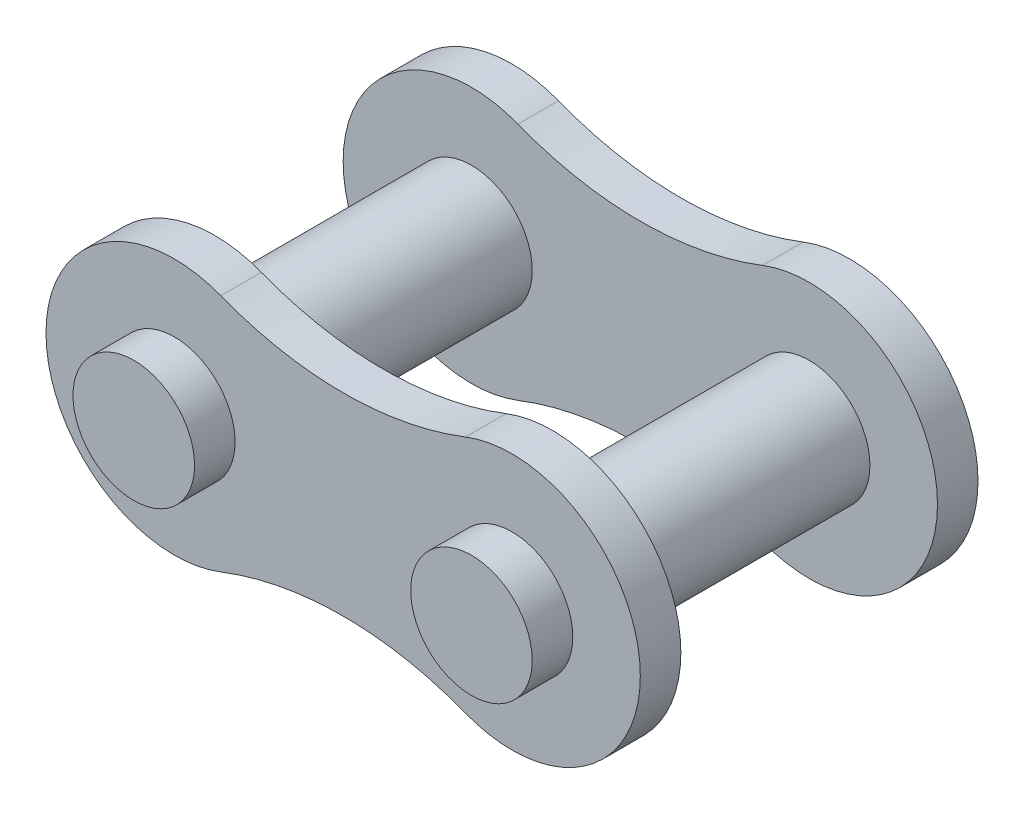
ISO-10303-21;
HEADER;
FILE_DESCRIPTION(('STEP AP214'),'2;1');
FILE_NAME('part.step','',(''),(''),'','','');
FILE_SCHEMA(('AUTOMOTIVE_DESIGN { 1 0 10303 214 1 1 1 1 }'));
ENDSEC;
DATA;
#1=APPLICATION_CONTEXT('core data for automotive mechanical design processes');
#2=APPLICATION_PROTOCOL_DEFINITION('international standard','automotive_design',2000,#1);
#3=PRODUCT_CONTEXT('',#1,'mechanical');
#4=PRODUCT('Part','Part','',(#3));
#5=PRODUCT_RELATED_PRODUCT_CATEGORY('part','',(#4));
#6=PRODUCT_DEFINITION_FORMATION('','',#4);
#7=PRODUCT_DEFINITION_CONTEXT('part definition',#1,'design');
#8=PRODUCT_DEFINITION('design','',#6,#7);
#9=PRODUCT_DEFINITION_SHAPE('','',#8);
#10=(LENGTH_UNIT() NAMED_UNIT(*) SI_UNIT(.MILLI.,.METRE.));
#11=(NAMED_UNIT(*) PLANE_ANGLE_UNIT() SI_UNIT($,.RADIAN.));
#12=(NAMED_UNIT(*) SI_UNIT($,.STERADIAN.) SOLID_ANGLE_UNIT());
#13=UNCERTAINTY_MEASURE_WITH_UNIT(LENGTH_MEASURE(1.E-05),#10,'distance_accuracy_value','');
#14=(GEOMETRIC_REPRESENTATION_CONTEXT(3) GLOBAL_UNCERTAINTY_ASSIGNED_CONTEXT((#13)) GLOBAL_UNIT_ASSIGNED_CONTEXT((#10,
#11,#12)) REPRESENTATION_CONTEXT('',''));
#15=CARTESIAN_POINT('',(0.,0.,0.));
#16=DIRECTION('',(0.,0.,1.));
#17=DIRECTION('',(1.,0.,0.));
#18=AXIS2_PLACEMENT_3D('',#15,#16,#17);
#19=CARTESIAN_POINT('',(-12.7,0.,3.937));
#20=DIRECTION('',(0.,0.,-1.));
#21=DIRECTION('',(-1.,0.,0.));
#22=AXIS2_PLACEMENT_3D('',#19,#20,#21);
#23=CYLINDRICAL_SURFACE('',#22,1.143);
#24=CARTESIAN_POINT('',(-12.7,0.,-2.413));
#25=DIRECTION('',(0.,0.,1.));
#26=DIRECTION('',(1.,0.,0.));
#27=AXIS2_PLACEMENT_3D('',#24,#25,#26);
#28=CIRCLE('',#27,1.143);
#29=CARTESIAN_POINT('',(-11.557,0.,-2.413));
#30=VERTEX_POINT('',#29);
#31=EDGE_CURVE('E170',#30,#30,#28,.T.);
#32=ORIENTED_EDGE('',*,*,#31,.T.);
#33=EDGE_LOOP('',(#32));
#34=FACE_BOUND('',#33,.T.);
#35=CARTESIAN_POINT('',(-12.7,0.,2.413));
#36=DIRECTION('',(0.,0.,1.));
#37=DIRECTION('',(1.,0.,0.));
#38=AXIS2_PLACEMENT_3D('',#35,#36,#37);
#39=CIRCLE('',#38,1.143);
#40=CARTESIAN_POINT('',(-11.557,0.,2.413));
#41=VERTEX_POINT('',#40);
#42=EDGE_CURVE('E11',#41,#41,#39,.T.);
#43=ORIENTED_EDGE('',*,*,#42,.F.);
#44=EDGE_LOOP('',(#43));
#45=FACE_BOUND('',#44,.T.);
#46=ADVANCED_FACE('F37',(#34,#45),#23,.T.);
#47=CARTESIAN_POINT('',(-9.525,-8.16759107693327,-2.413));
#48=DIRECTION('',(0.,0.,-1.));
#49=DIRECTION('',(1.,0.,0.));
#50=AXIS2_PLACEMENT_3D('',#47,#48,#49);
#51=CYLINDRICAL_SURFACE('',#50,6.35);
#52=CARTESIAN_POINT('',(-9.525,-8.16759107693327,-3.175));
#53=DIRECTION('',(0.,0.,-1.));
#54=DIRECTION('',(1.,0.,0.));
#55=AXIS2_PLACEMENT_3D('',#52,#53,#54);
#56=CIRCLE('',#55,6.35);
#57=CARTESIAN_POINT('',(-11.8257246376812,-2.24904681828597,-3.175));
#58=VERTEX_POINT('',#57);
#59=CARTESIAN_POINT('',(-7.22427536231884,-2.24904681828597,-3.175));
#60=VERTEX_POINT('',#59);
#61=EDGE_CURVE('E173',#58,#60,#56,.T.);
#62=ORIENTED_EDGE('',*,*,#61,.T.);
#63=DIRECTION('',(0.,0.,-1.));
#64=VECTOR('',#63,1.);
#65=CARTESIAN_POINT('',(-7.22427536231884,-2.24904681828597,-2.413));
#66=LINE('',#65,#64);
#67=CARTESIAN_POINT('',(-7.22427536231884,-2.24904681828597,-2.413));
#68=VERTEX_POINT('',#67);
#69=EDGE_CURVE('E180',#68,#60,#66,.T.);
#70=ORIENTED_EDGE('',*,*,#69,.F.);
#71=CARTESIAN_POINT('',(-9.525,-8.16759107693327,-2.413));
#72=DIRECTION('',(0.,0.,-1.));
#73=DIRECTION('',(1.,0.,0.));
#74=AXIS2_PLACEMENT_3D('',#71,#72,#73);
#75=CIRCLE('',#74,6.35);
#76=CARTESIAN_POINT('',(-11.8257246376812,-2.24904681828597,-2.413));
#77=VERTEX_POINT('',#76);
#78=EDGE_CURVE('E174',#77,#68,#75,.T.);
#79=ORIENTED_EDGE('',*,*,#78,.F.);
#80=DIRECTION('',(0.,0.,-1.));
#81=VECTOR('',#80,1.);
#82=CARTESIAN_POINT('',(-11.8257246376812,-2.24904681828597,-2.413));
#83=LINE('',#82,#81);
#84=EDGE_CURVE('E46',#77,#58,#83,.T.);
#85=ORIENTED_EDGE('',*,*,#84,.T.);
#86=EDGE_LOOP('',(#62,#70,#79,#85));
#87=FACE_BOUND('',#86,.T.);
#88=ADVANCED_FACE('F39',(#87),#51,.F.);
#89=CARTESIAN_POINT('',(-12.7,0.,-2.413));
#90=DIRECTION('',(0.,0.,-1.));
#91=DIRECTION('',(1.,0.,0.));
#92=AXIS2_PLACEMENT_3D('',#89,#90,#91);
#93=CYLINDRICAL_SURFACE('',#92,2.413);
#94=CARTESIAN_POINT('',(-12.7,0.,-3.175));
#95=DIRECTION('',(0.,0.,1.));
#96=DIRECTION('',(1.,0.,0.));
#97=AXIS2_PLACEMENT_3D('',#94,#95,#96);
#98=CIRCLE('',#97,2.413);
#99=CARTESIAN_POINT('',(-11.8257246376812,2.24904681828597,-3.175));
#100=VERTEX_POINT('',#99);
#101=EDGE_CURVE('E78',#100,#58,#98,.T.);
#102=ORIENTED_EDGE('',*,*,#101,.T.);
#103=ORIENTED_EDGE('',*,*,#84,.F.);
#104=CARTESIAN_POINT('',(-12.7,0.,-2.413));
#105=DIRECTION('',(0.,0.,1.));
#106=DIRECTION('',(1.,0.,0.));
#107=AXIS2_PLACEMENT_3D('',#104,#105,#106);
#108=CIRCLE('',#107,2.413);
#109=CARTESIAN_POINT('',(-11.8257246376812,2.24904681828597,-2.413));
#110=VERTEX_POINT('',#109);
#111=EDGE_CURVE('E54',#110,#77,#108,.T.);
#112=ORIENTED_EDGE('',*,*,#111,.F.);
#113=DIRECTION('',(0.,0.,-1.));
#114=VECTOR('',#113,1.);
#115=CARTESIAN_POINT('',(-11.8257246376812,2.24904681828597,-2.413));
#116=LINE('',#115,#114);
#117=EDGE_CURVE('E188',#110,#100,#116,.T.);
#118=ORIENTED_EDGE('',*,*,#117,.T.);
#119=EDGE_LOOP('',(#102,#103,#112,#118));
#120=FACE_BOUND('',#119,.T.);
#121=ADVANCED_FACE('F222',(#120),#93,.T.);
#122=CARTESIAN_POINT('',(-9.525,8.16759107693327,-2.413));
#123=DIRECTION('',(0.,0.,-1.));
#124=DIRECTION('',(1.,0.,0.));
#125=AXIS2_PLACEMENT_3D('',#122,#123,#124);
#126=CYLINDRICAL_SURFACE('',#125,6.35);
#127=CARTESIAN_POINT('',(-9.525,8.16759107693327,-3.175));
#128=DIRECTION('',(0.,0.,-1.));
#129=DIRECTION('',(1.,0.,0.));
#130=AXIS2_PLACEMENT_3D('',#127,#128,#129);
#131=CIRCLE('',#130,6.35);
#132=CARTESIAN_POINT('',(-7.22427536231884,2.24904681828597,-3.175));
#133=VERTEX_POINT('',#132);
#134=EDGE_CURVE('E72',#133,#100,#131,.T.);
#135=ORIENTED_EDGE('',*,*,#134,.T.);
#136=ORIENTED_EDGE('',*,*,#117,.F.);
#137=CARTESIAN_POINT('',(-9.525,8.16759107693327,-2.413));
#138=DIRECTION('',(0.,0.,-1.));
#139=DIRECTION('',(1.,0.,0.));
#140=AXIS2_PLACEMENT_3D('',#137,#138,#139);
#141=CIRCLE('',#140,6.35);
#142=CARTESIAN_POINT('',(-7.22427536231884,2.24904681828597,-2.413));
#143=VERTEX_POINT('',#142);
#144=EDGE_CURVE('E177',#143,#110,#141,.T.);
#145=ORIENTED_EDGE('',*,*,#144,.F.);
#146=DIRECTION('',(0.,0.,-1.));
#147=VECTOR('',#146,1.);
#148=CARTESIAN_POINT('',(-7.22427536231884,2.24904681828597,-2.413));
#149=LINE('',#148,#147);
#150=EDGE_CURVE('E190',#143,#133,#149,.T.);
#151=ORIENTED_EDGE('',*,*,#150,.T.);
#152=EDGE_LOOP('',(#135,#136,#145,#151));
#153=FACE_BOUND('',#152,.T.);
#154=ADVANCED_FACE('F373',(#153),#126,.F.);
#155=CARTESIAN_POINT('',(-6.35,0.,-2.413));
#156=DIRECTION('',(0.,0.,-1.));
#157=DIRECTION('',(1.,0.,0.));
#158=AXIS2_PLACEMENT_3D('',#155,#156,#157);
#159=CYLINDRICAL_SURFACE('',#158,2.413);
#160=CARTESIAN_POINT('',(-6.35,0.,-3.175));
#161=DIRECTION('',(0.,0.,1.));
#162=DIRECTION('',(1.,0.,0.));
#163=AXIS2_PLACEMENT_3D('',#160,#161,#162);
#164=CIRCLE('',#163,2.413);
#165=EDGE_CURVE('E183',#60,#133,#164,.T.);
#166=ORIENTED_EDGE('',*,*,#165,.T.);
#167=ORIENTED_EDGE('',*,*,#150,.F.);
#168=CARTESIAN_POINT('',(-6.35,0.,-2.413));
#169=DIRECTION('',(0.,0.,1.));
#170=DIRECTION('',(1.,0.,0.));
#171=AXIS2_PLACEMENT_3D('',#168,#169,#170);
#172=CIRCLE('',#171,2.413);
#173=EDGE_CURVE('E86',#68,#143,#172,.T.);
#174=ORIENTED_EDGE('',*,*,#173,.F.);
#175=ORIENTED_EDGE('',*,*,#69,.T.);
#176=EDGE_LOOP('',(#166,#167,#174,#175));
#177=FACE_BOUND('',#176,.T.);
#178=ADVANCED_FACE('F192',(#177),#159,.T.);
#179=CARTESIAN_POINT('',(-11.1125,-4.08379553846664,-2.413));
#180=DIRECTION('',(0.,0.,-1.));
#181=DIRECTION('',(1.,0.,0.));
#182=AXIS2_PLACEMENT_3D('',#179,#180,#181);
#183=PLANE('',#182);
#184=CARTESIAN_POINT('',(-6.35,0.,-2.413));
#185=DIRECTION('',(0.,0.,1.));
#186=DIRECTION('',(1.,0.,0.));
#187=AXIS2_PLACEMENT_3D('',#184,#185,#186);
#188=CIRCLE('',#187,1.143);
#189=CARTESIAN_POINT('',(-5.207,0.,-2.413));
#190=VERTEX_POINT('',#189);
#191=EDGE_CURVE('E167',#190,#190,#188,.T.);
#192=ORIENTED_EDGE('',*,*,#191,.F.);
#193=EDGE_LOOP('',(#192));
#194=FACE_BOUND('',#193,.T.);
#195=ORIENTED_EDGE('',*,*,#31,.F.);
#196=EDGE_LOOP('',(#195));
#197=FACE_BOUND('',#196,.T.);
#198=ORIENTED_EDGE('',*,*,#78,.T.);
#199=ORIENTED_EDGE('',*,*,#173,.T.);
#200=ORIENTED_EDGE('',*,*,#144,.T.);
#201=ORIENTED_EDGE('',*,*,#111,.T.);
#202=EDGE_LOOP('',(#198,#199,#200,#201));
#203=FACE_BOUND('',#202,.T.);
#204=ADVANCED_FACE('F200',(#194,#197,#203),#183,.F.);
#205=CARTESIAN_POINT('',(-11.1125,-4.08379553846664,-3.175));
#206=DIRECTION('',(0.,0.,-1.));
#207=DIRECTION('',(1.,0.,0.));
#208=AXIS2_PLACEMENT_3D('',#205,#206,#207);
#209=PLANE('',#208);
#210=CARTESIAN_POINT('',(-6.35,0.,-3.175));
#211=DIRECTION('',(0.,0.,-1.));
#212=DIRECTION('',(-1.,0.,0.));
#213=AXIS2_PLACEMENT_3D('',#210,#211,#212);
#214=CIRCLE('',#213,1.143);
#215=CARTESIAN_POINT('',(-7.493,0.,-3.175));
#216=VERTEX_POINT('',#215);
#217=EDGE_CURVE('E357',#216,#216,#214,.F.);
#218=ORIENTED_EDGE('',*,*,#217,.T.);
#219=EDGE_LOOP('',(#218));
#220=FACE_BOUND('',#219,.T.);
#221=CARTESIAN_POINT('',(-12.7,0.,-3.175));
#222=DIRECTION('',(0.,0.,-1.));
#223=DIRECTION('',(-1.,0.,0.));
#224=AXIS2_PLACEMENT_3D('',#221,#222,#223);
#225=CIRCLE('',#224,1.143);
#226=CARTESIAN_POINT('',(-13.843,0.,-3.175));
#227=VERTEX_POINT('',#226);
#228=EDGE_CURVE('E162',#227,#227,#225,.F.);
#229=ORIENTED_EDGE('',*,*,#228,.T.);
#230=EDGE_LOOP('',(#229));
#231=FACE_BOUND('',#230,.T.);
#232=ORIENTED_EDGE('',*,*,#61,.F.);
#233=ORIENTED_EDGE('',*,*,#101,.F.);
#234=ORIENTED_EDGE('',*,*,#134,.F.);
#235=ORIENTED_EDGE('',*,*,#165,.F.);
#236=EDGE_LOOP('',(#232,#233,#234,#235));
#237=FACE_BOUND('',#236,.T.);
#238=ADVANCED_FACE('F197',(#220,#231,#237),#209,.T.);
#239=CARTESIAN_POINT('',(-12.7,0.,-3.937));
#240=DIRECTION('',(0.,0.,1.));
#241=DIRECTION('',(1.,0.,0.));
#242=AXIS2_PLACEMENT_3D('',#239,#240,#241);
#243=PLANE('',#242);
#244=CARTESIAN_POINT('',(-12.7,0.,-3.937));
#245=DIRECTION('',(0.,0.,1.));
#246=DIRECTION('',(1.,0.,0.));
#247=AXIS2_PLACEMENT_3D('',#244,#245,#246);
#248=CIRCLE('',#247,1.143);
#249=CARTESIAN_POINT('',(-11.557,0.,-3.937));
#250=VERTEX_POINT('',#249);
#251=EDGE_CURVE('E155',#250,#250,#248,.T.);
#252=ORIENTED_EDGE('',*,*,#251,.F.);
#253=EDGE_LOOP('',(#252));
#254=FACE_BOUND('',#253,.T.);
#255=ADVANCED_FACE('F199',(#254),#243,.F.);
#256=ORIENTED_EDGE('',*,*,#228,.F.);
#257=EDGE_LOOP('',(#256));
#258=FACE_BOUND('',#257,.T.);
#259=ORIENTED_EDGE('',*,*,#251,.T.);
#260=EDGE_LOOP('',(#259));
#261=FACE_BOUND('',#260,.T.);
#262=ADVANCED_FACE('F207',(#258,#261),#23,.T.);
#263=CARTESIAN_POINT('',(-9.525,-8.16759107693327,2.413));
#264=DIRECTION('',(0.,0.,1.));
#265=DIRECTION('',(1.,0.,0.));
#266=AXIS2_PLACEMENT_3D('',#263,#264,#265);
#267=CYLINDRICAL_SURFACE('',#266,6.35);
#268=CARTESIAN_POINT('',(-9.525,-8.16759107693327,3.175));
#269=DIRECTION('',(0.,0.,-1.));
#270=DIRECTION('',(1.,0.,0.));
#271=AXIS2_PLACEMENT_3D('',#268,#269,#270);
#272=CIRCLE('',#271,6.35);
#273=CARTESIAN_POINT('',(-11.8257246376812,-2.24904681828597,3.175));
#274=VERTEX_POINT('',#273);
#275=CARTESIAN_POINT('',(-7.22427536231884,-2.24904681828597,3.175));
#276=VERTEX_POINT('',#275);
#277=EDGE_CURVE('E149',#274,#276,#272,.T.);
#278=ORIENTED_EDGE('',*,*,#277,.F.);
#279=DIRECTION('',(0.,0.,1.));
#280=VECTOR('',#279,1.);
#281=CARTESIAN_POINT('',(-11.8257246376812,-2.24904681828597,2.413));
#282=LINE('',#281,#280);
#283=CARTESIAN_POINT('',(-11.8257246376812,-2.24904681828597,2.413));
#284=VERTEX_POINT('',#283);
#285=EDGE_CURVE('E137',#284,#274,#282,.T.);
#286=ORIENTED_EDGE('',*,*,#285,.F.);
#287=CARTESIAN_POINT('',(-9.525,-8.16759107693327,2.413));
#288=DIRECTION('',(0.,0.,-1.));
#289=DIRECTION('',(1.,0.,0.));
#290=AXIS2_PLACEMENT_3D('',#287,#288,#289);
#291=CIRCLE('',#290,6.35);
#292=CARTESIAN_POINT('',(-7.22427536231884,-2.24904681828597,2.413));
#293=VERTEX_POINT('',#292);
#294=EDGE_CURVE('E131',#284,#293,#291,.T.);
#295=ORIENTED_EDGE('',*,*,#294,.T.);
#296=DIRECTION('',(0.,0.,1.));
#297=VECTOR('',#296,1.);
#298=CARTESIAN_POINT('',(-7.22427536231884,-2.24904681828597,2.413));
#299=LINE('',#298,#297);
#300=EDGE_CURVE('E113',#293,#276,#299,.T.);
#301=ORIENTED_EDGE('',*,*,#300,.T.);
#302=EDGE_LOOP('',(#278,#286,#295,#301));
#303=FACE_BOUND('',#302,.T.);
#304=ADVANCED_FACE('F136',(#303),#267,.F.);
#305=CARTESIAN_POINT('',(-12.7,0.,2.413));
#306=DIRECTION('',(0.,0.,1.));
#307=DIRECTION('',(1.,0.,0.));
#308=AXIS2_PLACEMENT_3D('',#305,#306,#307);
#309=CYLINDRICAL_SURFACE('',#308,2.413);
#310=CARTESIAN_POINT('',(-12.7,0.,3.175));
#311=DIRECTION('',(0.,0.,1.));
#312=DIRECTION('',(1.,0.,0.));
#313=AXIS2_PLACEMENT_3D('',#310,#311,#312);
#314=CIRCLE('',#313,2.413);
#315=CARTESIAN_POINT('',(-11.8257246376812,2.24904681828597,3.175));
#316=VERTEX_POINT('',#315);
#317=EDGE_CURVE('E138',#316,#274,#314,.T.);
#318=ORIENTED_EDGE('',*,*,#317,.F.);
#319=DIRECTION('',(0.,0.,1.));
#320=VECTOR('',#319,1.);
#321=CARTESIAN_POINT('',(-11.8257246376812,2.24904681828597,2.413));
#322=LINE('',#321,#320);
#323=CARTESIAN_POINT('',(-11.8257246376812,2.24904681828597,2.413));
#324=VERTEX_POINT('',#323);
#325=EDGE_CURVE('E156',#324,#316,#322,.T.);
#326=ORIENTED_EDGE('',*,*,#325,.F.);
#327=CARTESIAN_POINT('',(-12.7,0.,2.413));
#328=DIRECTION('',(0.,0.,1.));
#329=DIRECTION('',(1.,0.,0.));
#330=AXIS2_PLACEMENT_3D('',#327,#328,#329);
#331=CIRCLE('',#330,2.413);
#332=EDGE_CURVE('E124',#324,#284,#331,.T.);
#333=ORIENTED_EDGE('',*,*,#332,.T.);
#334=ORIENTED_EDGE('',*,*,#285,.T.);
#335=EDGE_LOOP('',(#318,#326,#333,#334));
#336=FACE_BOUND('',#335,.T.);
#337=ADVANCED_FACE('F233',(#336),#309,.T.);
#338=CARTESIAN_POINT('',(-9.525,8.16759107693327,2.413));
#339=DIRECTION('',(0.,0.,1.));
#340=DIRECTION('',(1.,0.,0.));
#341=AXIS2_PLACEMENT_3D('',#338,#339,#340);
#342=CYLINDRICAL_SURFACE('',#341,6.35);
#343=CARTESIAN_POINT('',(-9.525,8.16759107693327,3.175));
#344=DIRECTION('',(0.,0.,-1.));
#345=DIRECTION('',(1.,0.,0.));
#346=AXIS2_PLACEMENT_3D('',#343,#344,#345);
#347=CIRCLE('',#346,6.35);
#348=CARTESIAN_POINT('',(-7.22427536231884,2.24904681828597,3.175));
#349=VERTEX_POINT('',#348);
#350=EDGE_CURVE('E141',#349,#316,#347,.T.);
#351=ORIENTED_EDGE('',*,*,#350,.F.);
#352=DIRECTION('',(0.,0.,1.));
#353=VECTOR('',#352,1.);
#354=CARTESIAN_POINT('',(-7.22427536231884,2.24904681828597,2.413));
#355=LINE('',#354,#353);
#356=CARTESIAN_POINT('',(-7.22427536231884,2.24904681828597,2.413));
#357=VERTEX_POINT('',#356);
#358=EDGE_CURVE('E123',#357,#349,#355,.T.);
#359=ORIENTED_EDGE('',*,*,#358,.F.);
#360=CARTESIAN_POINT('',(-9.525,8.16759107693327,2.413));
#361=DIRECTION('',(0.,0.,-1.));
#362=DIRECTION('',(1.,0.,0.));
#363=AXIS2_PLACEMENT_3D('',#360,#361,#362);
#364=CIRCLE('',#363,6.35);
#365=EDGE_CURVE('E134',#357,#324,#364,.T.);
#366=ORIENTED_EDGE('',*,*,#365,.T.);
#367=ORIENTED_EDGE('',*,*,#325,.T.);
#368=EDGE_LOOP('',(#351,#359,#366,#367));
#369=FACE_BOUND('',#368,.T.);
#370=ADVANCED_FACE('F241',(#369),#342,.F.);
#371=CARTESIAN_POINT('',(-6.35,0.,2.413));
#372=DIRECTION('',(0.,0.,1.));
#373=DIRECTION('',(1.,0.,0.));
#374=AXIS2_PLACEMENT_3D('',#371,#372,#373);
#375=CYLINDRICAL_SURFACE('',#374,2.413);
#376=CARTESIAN_POINT('',(-6.35,0.,3.175));
#377=DIRECTION('',(0.,0.,1.));
#378=DIRECTION('',(1.,0.,0.));
#379=AXIS2_PLACEMENT_3D('',#376,#377,#378);
#380=CIRCLE('',#379,2.413);
#381=EDGE_CURVE('E118',#276,#349,#380,.T.);
#382=ORIENTED_EDGE('',*,*,#381,.F.);
#383=ORIENTED_EDGE('',*,*,#300,.F.);
#384=CARTESIAN_POINT('',(-6.35,0.,2.413));
#385=DIRECTION('',(0.,0.,1.));
#386=DIRECTION('',(1.,0.,0.));
#387=AXIS2_PLACEMENT_3D('',#384,#385,#386);
#388=CIRCLE('',#387,2.413);
#389=EDGE_CURVE('E116',#293,#357,#388,.T.);
#390=ORIENTED_EDGE('',*,*,#389,.T.);
#391=ORIENTED_EDGE('',*,*,#358,.T.);
#392=EDGE_LOOP('',(#382,#383,#390,#391));
#393=FACE_BOUND('',#392,.T.);
#394=ADVANCED_FACE('F115',(#393),#375,.T.);
#395=CARTESIAN_POINT('',(-11.1125,-4.08379553846664,2.413));
#396=DIRECTION('',(0.,0.,1.));
#397=DIRECTION('',(1.,0.,0.));
#398=AXIS2_PLACEMENT_3D('',#395,#396,#397);
#399=PLANE('',#398);
#400=CARTESIAN_POINT('',(-6.35,0.,2.413));
#401=DIRECTION('',(0.,0.,1.));
#402=DIRECTION('',(1.,0.,0.));
#403=AXIS2_PLACEMENT_3D('',#400,#401,#402);
#404=CIRCLE('',#403,1.143);
#405=CARTESIAN_POINT('',(-5.207,0.,2.413));
#406=VERTEX_POINT('',#405);
#407=EDGE_CURVE('E352',#406,#406,#404,.F.);
#408=ORIENTED_EDGE('',*,*,#407,.F.);
#409=EDGE_LOOP('',(#408));
#410=FACE_BOUND('',#409,.T.);
#411=ORIENTED_EDGE('',*,*,#42,.T.);
#412=EDGE_LOOP('',(#411));
#413=FACE_BOUND('',#412,.T.);
#414=ORIENTED_EDGE('',*,*,#294,.F.);
#415=ORIENTED_EDGE('',*,*,#332,.F.);
#416=ORIENTED_EDGE('',*,*,#365,.F.);
#417=ORIENTED_EDGE('',*,*,#389,.F.);
#418=EDGE_LOOP('',(#414,#415,#416,#417));
#419=FACE_BOUND('',#418,.T.);
#420=ADVANCED_FACE('F129',(#410,#413,#419),#399,.F.);
#421=CARTESIAN_POINT('',(-11.1125,-4.08379553846664,3.175));
#422=DIRECTION('',(0.,0.,1.));
#423=DIRECTION('',(1.,0.,0.));
#424=AXIS2_PLACEMENT_3D('',#421,#422,#423);
#425=PLANE('',#424);
#426=CARTESIAN_POINT('',(-6.35,0.,3.175));
#427=DIRECTION('',(0.,0.,1.));
#428=DIRECTION('',(1.,0.,0.));
#429=AXIS2_PLACEMENT_3D('',#426,#427,#428);
#430=CIRCLE('',#429,1.143);
#431=CARTESIAN_POINT('',(-5.207,0.,3.175));
#432=VERTEX_POINT('',#431);
#433=EDGE_CURVE('E358',#432,#432,#430,.T.);
#434=ORIENTED_EDGE('',*,*,#433,.F.);
#435=EDGE_LOOP('',(#434));
#436=FACE_BOUND('',#435,.T.);
#437=CARTESIAN_POINT('',(-12.7,0.,3.175));
#438=DIRECTION('',(0.,0.,1.));
#439=DIRECTION('',(1.,0.,0.));
#440=AXIS2_PLACEMENT_3D('',#437,#438,#439);
#441=CIRCLE('',#440,1.143);
#442=CARTESIAN_POINT('',(-11.557,0.,3.175));
#443=VERTEX_POINT('',#442);
#444=EDGE_CURVE('E144',#443,#443,#441,.T.);
#445=ORIENTED_EDGE('',*,*,#444,.F.);
#446=EDGE_LOOP('',(#445));
#447=FACE_BOUND('',#446,.T.);
#448=ORIENTED_EDGE('',*,*,#277,.T.);
#449=ORIENTED_EDGE('',*,*,#381,.T.);
#450=ORIENTED_EDGE('',*,*,#350,.T.);
#451=ORIENTED_EDGE('',*,*,#317,.T.);
#452=EDGE_LOOP('',(#448,#449,#450,#451));
#453=FACE_BOUND('',#452,.T.);
#454=ADVANCED_FACE('F248',(#436,#447,#453),#425,.T.);
#455=CARTESIAN_POINT('',(-12.7,0.,3.937));
#456=DIRECTION('',(0.,0.,1.));
#457=DIRECTION('',(1.,0.,0.));
#458=AXIS2_PLACEMENT_3D('',#455,#456,#457);
#459=PLANE('',#458);
#460=CARTESIAN_POINT('',(-12.7,0.,3.937));
#461=DIRECTION('',(0.,0.,1.));
#462=DIRECTION('',(1.,0.,0.));
#463=AXIS2_PLACEMENT_3D('',#460,#461,#462);
#464=CIRCLE('',#463,1.143);
#465=CARTESIAN_POINT('',(-11.557,0.,3.937));
#466=VERTEX_POINT('',#465);
#467=EDGE_CURVE('E159',#466,#466,#464,.T.);
#468=ORIENTED_EDGE('',*,*,#467,.T.);
#469=EDGE_LOOP('',(#468));
#470=FACE_BOUND('',#469,.T.);
#471=ADVANCED_FACE('F226',(#470),#459,.T.);
#472=ORIENTED_EDGE('',*,*,#444,.T.);
#473=EDGE_LOOP('',(#472));
#474=FACE_BOUND('',#473,.T.);
#475=ORIENTED_EDGE('',*,*,#467,.F.);
#476=EDGE_LOOP('',(#475));
#477=FACE_BOUND('',#476,.T.);
#478=ADVANCED_FACE('F218',(#474,#477),#23,.T.);
#479=CARTESIAN_POINT('',(-6.35,0.,3.937));
#480=DIRECTION('',(0.,0.,1.));
#481=DIRECTION('',(1.,0.,0.));
#482=AXIS2_PLACEMENT_3D('',#479,#480,#481);
#483=PLANE('',#482);
#484=CARTESIAN_POINT('',(-6.35,0.,3.937));
#485=DIRECTION('',(0.,0.,1.));
#486=DIRECTION('',(1.,0.,0.));
#487=AXIS2_PLACEMENT_3D('',#484,#485,#486);
#488=CIRCLE('',#487,1.143);
#489=CARTESIAN_POINT('',(-5.207,0.,3.937));
#490=VERTEX_POINT('',#489);
#491=EDGE_CURVE('E349',#490,#490,#488,.T.);
#492=ORIENTED_EDGE('',*,*,#491,.T.);
#493=EDGE_LOOP('',(#492));
#494=FACE_BOUND('',#493,.T.);
#495=ADVANCED_FACE('F225',(#494),#483,.T.);
#496=CARTESIAN_POINT('',(-6.35,0.,3.937));
#497=DIRECTION('',(0.,0.,-1.));
#498=DIRECTION('',(-1.,0.,0.));
#499=AXIS2_PLACEMENT_3D('',#496,#497,#498);
#500=CYLINDRICAL_SURFACE('',#499,1.143);
#501=ORIENTED_EDGE('',*,*,#433,.T.);
#502=EDGE_LOOP('',(#501));
#503=FACE_BOUND('',#502,.T.);
#504=ORIENTED_EDGE('',*,*,#491,.F.);
#505=EDGE_LOOP('',(#504));
#506=FACE_BOUND('',#505,.T.);
#507=ADVANCED_FACE('F304',(#503,#506),#500,.T.);
#508=ORIENTED_EDGE('',*,*,#407,.T.);
#509=EDGE_LOOP('',(#508));
#510=FACE_BOUND('',#509,.T.);
#511=ORIENTED_EDGE('',*,*,#191,.T.);
#512=EDGE_LOOP('',(#511));
#513=FACE_BOUND('',#512,.T.);
#514=ADVANCED_FACE('F314',(#510,#513),#500,.T.);
#515=ORIENTED_EDGE('',*,*,#217,.F.);
#516=EDGE_LOOP('',(#515));
#517=FACE_BOUND('',#516,.T.);
#518=CARTESIAN_POINT('',(-6.35,0.,-3.937));
#519=DIRECTION('',(0.,0.,1.));
#520=DIRECTION('',(1.,0.,0.));
#521=AXIS2_PLACEMENT_3D('',#518,#519,#520);
#522=CIRCLE('',#521,1.143);
#523=CARTESIAN_POINT('',(-5.207,0.,-3.937));
#524=VERTEX_POINT('',#523);
#525=EDGE_CURVE('E347',#524,#524,#522,.T.);
#526=ORIENTED_EDGE('',*,*,#525,.T.);
#527=EDGE_LOOP('',(#526));
#528=FACE_BOUND('',#527,.T.);
#529=ADVANCED_FACE('F316',(#517,#528),#500,.T.);
#530=CARTESIAN_POINT('',(-6.35,0.,-3.937));
#531=DIRECTION('',(0.,0.,1.));
#532=DIRECTION('',(1.,0.,0.));
#533=AXIS2_PLACEMENT_3D('',#530,#531,#532);
#534=PLANE('',#533);
#535=ORIENTED_EDGE('',*,*,#525,.F.);
#536=EDGE_LOOP('',(#535));
#537=FACE_BOUND('',#536,.T.);
#538=ADVANCED_FACE('F332',(#537),#534,.F.);
#539=CLOSED_SHELL('',(#46,#88,#121,#154,#178,#204,#238,#255,#262,#304,#337,#370,#394,#420,#454,
#471,#478,#495,#507,#514,#529,#538));
#540=MANIFOLD_SOLID_BREP('B2',#539);
#541=ADVANCED_BREP_SHAPE_REPRESENTATION('',(#18,#540),#14);
#542=SHAPE_DEFINITION_REPRESENTATION(#9,#541);
ENDSEC;
END-ISO-10303-21;
